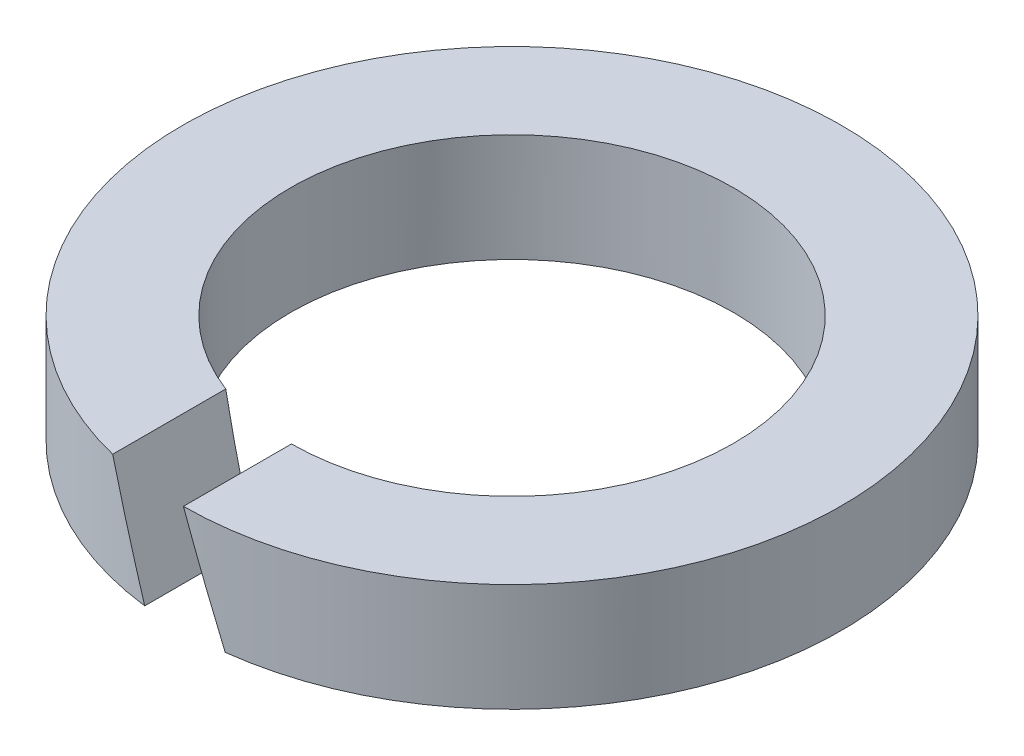
ISO-10303-21;
HEADER;
FILE_DESCRIPTION(('STEP AP214'),'2;1');
FILE_NAME('part.step','',(''),(''),'','','');
FILE_SCHEMA(('AUTOMOTIVE_DESIGN { 1 0 10303 214 1 1 1 1 }'));
ENDSEC;
DATA;
#1=APPLICATION_CONTEXT('core data for automotive mechanical design processes');
#2=APPLICATION_PROTOCOL_DEFINITION('international standard','automotive_design',2000,#1);
#3=PRODUCT_CONTEXT('',#1,'mechanical');
#4=PRODUCT('Part','Part','',(#3));
#5=PRODUCT_RELATED_PRODUCT_CATEGORY('part','',(#4));
#6=PRODUCT_DEFINITION_FORMATION('','',#4);
#7=PRODUCT_DEFINITION_CONTEXT('part definition',#1,'design');
#8=PRODUCT_DEFINITION('design','',#6,#7);
#9=PRODUCT_DEFINITION_SHAPE('','',#8);
#10=(LENGTH_UNIT() NAMED_UNIT(*) SI_UNIT(.MILLI.,.METRE.));
#11=(NAMED_UNIT(*) PLANE_ANGLE_UNIT() SI_UNIT($,.RADIAN.));
#12=(NAMED_UNIT(*) SI_UNIT($,.STERADIAN.) SOLID_ANGLE_UNIT());
#13=UNCERTAINTY_MEASURE_WITH_UNIT(LENGTH_MEASURE(1.E-05),#10,'distance_accuracy_value','');
#14=(GEOMETRIC_REPRESENTATION_CONTEXT(3) GLOBAL_UNCERTAINTY_ASSIGNED_CONTEXT((#13)) GLOBAL_UNIT_ASSIGNED_CONTEXT((#10,
#11,#12)) REPRESENTATION_CONTEXT('',''));
#15=CARTESIAN_POINT('',(0.,0.,0.));
#16=DIRECTION('',(0.,0.,1.));
#17=DIRECTION('',(1.,0.,0.));
#18=AXIS2_PLACEMENT_3D('',#15,#16,#17);
#19=CARTESIAN_POINT('',(0.,15.7596723055964,0.));
#20=DIRECTION('',(0.,1.,0.));
#21=DIRECTION('',(0.,0.,1.));
#22=AXIS2_PLACEMENT_3D('',#19,#20,#21);
#23=CYLINDRICAL_SURFACE('',#22,2.05);
#24=CARTESIAN_POINT('',(0.,0.,0.));
#25=DIRECTION('',(0.,1.,0.));
#26=DIRECTION('',(0.,0.,1.));
#27=AXIS2_PLACEMENT_3D('',#24,#25,#26);
#28=CIRCLE('',#27,2.05);
#29=CARTESIAN_POINT('',(0.372462220366569,0.,2.01587993055132));
#30=VERTEX_POINT('',#29);
#31=CARTESIAN_POINT('',(-0.372462220366569,0.,2.01587993055132));
#32=VERTEX_POINT('',#31);
#33=EDGE_CURVE('E91',#30,#32,#28,.T.);
#34=ORIENTED_EDGE('',*,*,#33,.F.);
#35=CARTESIAN_POINT('',(0.,1.02333154005709,0.));
#36=DIRECTION('',(-0.939692620785909,-0.342020143325666,0.));
#37=DIRECTION('',(-0.342020143325666,0.939692620785909,0.));
#38=AXIS2_PLACEMENT_3D('',#35,#36,#37);
#39=ELLIPSE('',#38,5.99379902033436,2.05);
#40=CARTESIAN_POINT('',(0.00849198610036937,1.,2.04998241118602));
#41=VERTEX_POINT('',#40);
#42=EDGE_CURVE('E56',#41,#30,#39,.F.);
#43=ORIENTED_EDGE('',*,*,#42,.F.);
#44=CARTESIAN_POINT('',(0.,1.,0.));
#45=DIRECTION('',(0.,1.,0.));
#46=DIRECTION('',(0.,0.,1.));
#47=AXIS2_PLACEMENT_3D('',#44,#45,#46);
#48=CIRCLE('',#47,2.05);
#49=CARTESIAN_POINT('',(-0.736432454632769,1.,1.913156355284));
#50=VERTEX_POINT('',#49);
#51=EDGE_CURVE('E11',#41,#50,#48,.T.);
#52=ORIENTED_EDGE('',*,*,#51,.T.);
#53=CARTESIAN_POINT('',(0.,-1.02333154005709,0.));
#54=DIRECTION('',(0.939692620785909,0.342020143325666,0.));
#55=DIRECTION('',(-0.342020143325666,0.939692620785909,0.));
#56=AXIS2_PLACEMENT_3D('',#53,#54,#55);
#57=ELLIPSE('',#56,5.99379902033436,2.05);
#58=EDGE_CURVE('E88',#32,#50,#57,.F.);
#59=ORIENTED_EDGE('',*,*,#58,.F.);
#60=EDGE_LOOP('',(#34,#43,#52,#59));
#61=FACE_BOUND('',#60,.T.);
#62=ADVANCED_FACE('F34',(#61),#23,.F.);
#63=CARTESIAN_POINT('',(-2.05,1.,0.));
#64=DIRECTION('',(0.,1.,0.));
#65=DIRECTION('',(0.,0.,1.));
#66=AXIS2_PLACEMENT_3D('',#63,#64,#65);
#67=PLANE('',#66);
#68=ORIENTED_EDGE('',*,*,#51,.F.);
#69=DIRECTION('',(0.,0.,-1.));
#70=VECTOR('',#69,1.);
#71=CARTESIAN_POINT('',(0.00849198610036937,1.,3.051));
#72=LINE('',#71,#70);
#73=CARTESIAN_POINT('',(0.00849198610036937,1.,3.04998817803808));
#74=VERTEX_POINT('',#73);
#75=EDGE_CURVE('E93',#74,#41,#72,.T.);
#76=ORIENTED_EDGE('',*,*,#75,.F.);
#77=CARTESIAN_POINT('',(0.,1.,0.));
#78=DIRECTION('',(0.,1.,0.));
#79=DIRECTION('',(0.,0.,1.));
#80=AXIS2_PLACEMENT_3D('',#77,#78,#79);
#81=CIRCLE('',#80,3.05);
#82=CARTESIAN_POINT('',(-0.736432454632769,1.,2.95975796979475));
#83=VERTEX_POINT('',#82);
#84=EDGE_CURVE('E41',#74,#83,#81,.T.);
#85=ORIENTED_EDGE('',*,*,#84,.T.);
#86=DIRECTION('',(0.,0.,-1.));
#87=VECTOR('',#86,1.);
#88=CARTESIAN_POINT('',(-0.736432454632769,1.,3.051));
#89=LINE('',#88,#87);
#90=EDGE_CURVE('E97',#83,#50,#89,.T.);
#91=ORIENTED_EDGE('',*,*,#90,.T.);
#92=EDGE_LOOP('',(#68,#76,#85,#91));
#93=FACE_BOUND('',#92,.T.);
#94=ADVANCED_FACE('F108',(#93),#67,.T.);
#95=CARTESIAN_POINT('',(0.,15.7596723055964,0.));
#96=DIRECTION('',(0.,1.,0.));
#97=DIRECTION('',(0.,0.,1.));
#98=AXIS2_PLACEMENT_3D('',#95,#96,#97);
#99=CYLINDRICAL_SURFACE('',#98,3.05);
#100=ORIENTED_EDGE('',*,*,#84,.F.);
#101=CARTESIAN_POINT('',(0.,1.02333154005709,0.));
#102=DIRECTION('',(-0.939692620785909,-0.342020143325666,0.));
#103=DIRECTION('',(-0.342020143325666,0.939692620785909,0.));
#104=AXIS2_PLACEMENT_3D('',#101,#102,#103);
#105=ELLIPSE('',#104,8.91760342049747,3.05);
#106=CARTESIAN_POINT('',(0.372462220366569,0.,3.02717226044366));
#107=VERTEX_POINT('',#106);
#108=EDGE_CURVE('E74',#107,#74,#105,.T.);
#109=ORIENTED_EDGE('',*,*,#108,.F.);
#110=CARTESIAN_POINT('',(0.,0.,0.));
#111=DIRECTION('',(0.,1.,0.));
#112=DIRECTION('',(0.,0.,1.));
#113=AXIS2_PLACEMENT_3D('',#110,#111,#112);
#114=CIRCLE('',#113,3.05);
#115=CARTESIAN_POINT('',(-0.372462220366569,0.,3.02717226044366));
#116=VERTEX_POINT('',#115);
#117=EDGE_CURVE('E86',#107,#116,#114,.T.);
#118=ORIENTED_EDGE('',*,*,#117,.T.);
#119=CARTESIAN_POINT('',(0.,-1.02333154005709,0.));
#120=DIRECTION('',(0.939692620785909,0.342020143325666,0.));
#121=DIRECTION('',(-0.342020143325666,0.939692620785909,0.));
#122=AXIS2_PLACEMENT_3D('',#119,#120,#121);
#123=ELLIPSE('',#122,8.91760342049747,3.05);
#124=EDGE_CURVE('E48',#83,#116,#123,.T.);
#125=ORIENTED_EDGE('',*,*,#124,.F.);
#126=EDGE_LOOP('',(#100,#109,#118,#125));
#127=FACE_BOUND('',#126,.T.);
#128=ADVANCED_FACE('F85',(#127),#99,.T.);
#129=CARTESIAN_POINT('',(-2.05,0.,0.));
#130=DIRECTION('',(0.,-1.,0.));
#131=DIRECTION('',(0.,0.,-1.));
#132=AXIS2_PLACEMENT_3D('',#129,#130,#131);
#133=PLANE('',#132);
#134=ORIENTED_EDGE('',*,*,#117,.F.);
#135=DIRECTION('',(0.,0.,-1.));
#136=VECTOR('',#135,1.);
#137=CARTESIAN_POINT('',(0.372462220366569,0.,3.051));
#138=LINE('',#137,#136);
#139=EDGE_CURVE('E71',#107,#30,#138,.T.);
#140=ORIENTED_EDGE('',*,*,#139,.T.);
#141=ORIENTED_EDGE('',*,*,#33,.T.);
#142=DIRECTION('',(0.,0.,-1.));
#143=VECTOR('',#142,1.);
#144=CARTESIAN_POINT('',(-0.372462220366569,0.,3.051));
#145=LINE('',#144,#143);
#146=EDGE_CURVE('E80',#116,#32,#145,.T.);
#147=ORIENTED_EDGE('',*,*,#146,.F.);
#148=EDGE_LOOP('',(#134,#140,#141,#147));
#149=FACE_BOUND('',#148,.T.);
#150=ADVANCED_FACE('F90',(#149),#133,.T.);
#151=CARTESIAN_POINT('',(-0.736432454632769,1.,3.051));
#152=DIRECTION('',(0.939692620785909,0.342020143325666,0.));
#153=DIRECTION('',(-0.342020143325666,0.939692620785909,0.));
#154=AXIS2_PLACEMENT_3D('',#151,#152,#153);
#155=PLANE('',#154);
#156=ORIENTED_EDGE('',*,*,#58,.T.);
#157=ORIENTED_EDGE('',*,*,#90,.F.);
#158=ORIENTED_EDGE('',*,*,#124,.T.);
#159=ORIENTED_EDGE('',*,*,#146,.T.);
#160=EDGE_LOOP('',(#156,#157,#158,#159));
#161=FACE_BOUND('',#160,.T.);
#162=ADVANCED_FACE('F104',(#161),#155,.T.);
#163=CARTESIAN_POINT('',(0.00849198610036937,1.,3.051));
#164=DIRECTION('',(-0.939692620785909,-0.342020143325666,0.));
#165=DIRECTION('',(0.342020143325666,-0.939692620785909,0.));
#166=AXIS2_PLACEMENT_3D('',#163,#164,#165);
#167=PLANE('',#166);
#168=ORIENTED_EDGE('',*,*,#42,.T.);
#169=ORIENTED_EDGE('',*,*,#139,.F.);
#170=ORIENTED_EDGE('',*,*,#108,.T.);
#171=ORIENTED_EDGE('',*,*,#75,.T.);
#172=EDGE_LOOP('',(#168,#169,#170,#171));
#173=FACE_BOUND('',#172,.T.);
#174=ADVANCED_FACE('F73',(#173),#167,.T.);
#175=CLOSED_SHELL('',(#62,#94,#128,#150,#162,#174));
#176=MANIFOLD_SOLID_BREP('B2',#175);
#177=ADVANCED_BREP_SHAPE_REPRESENTATION('',(#18,#176),#14);
#178=SHAPE_DEFINITION_REPRESENTATION(#9,#177);
ENDSEC;
END-ISO-10303-21;
